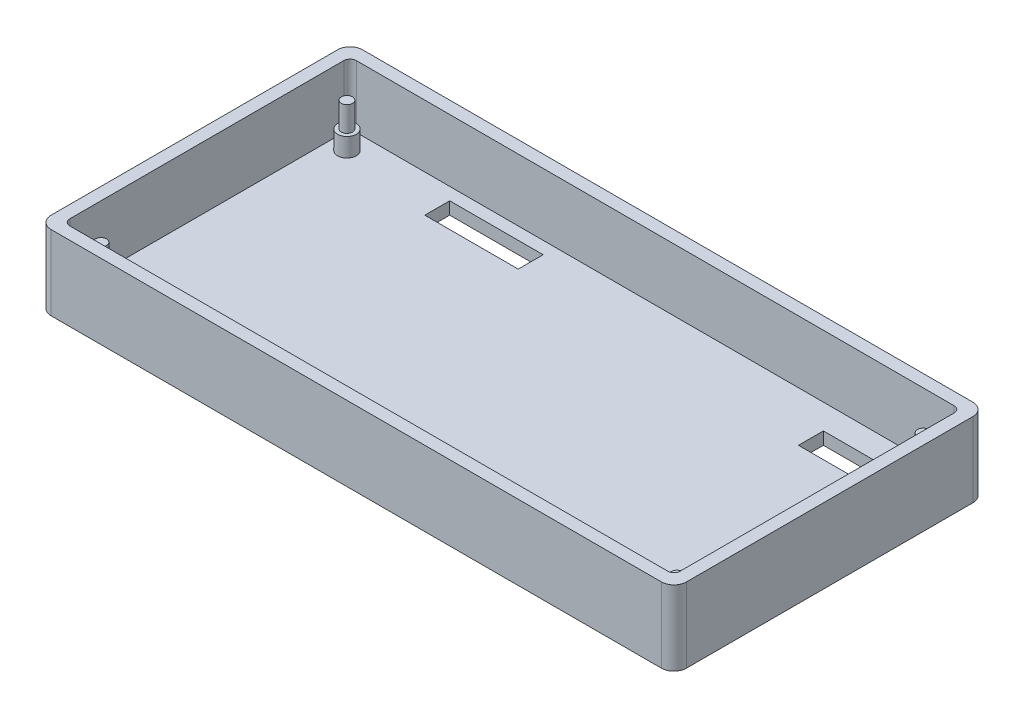
ISO-10303-21;
HEADER;
FILE_DESCRIPTION(('STEP AP214'),'2;1');
FILE_NAME('part.step','',(''),(''),'','','');
FILE_SCHEMA(('AUTOMOTIVE_DESIGN { 1 0 10303 214 1 1 1 1 }'));
ENDSEC;
DATA;
#1=APPLICATION_CONTEXT('core data for automotive mechanical design processes');
#2=APPLICATION_PROTOCOL_DEFINITION('international standard','automotive_design',2000,#1);
#3=PRODUCT_CONTEXT('',#1,'mechanical');
#4=PRODUCT('Part','Part','',(#3));
#5=PRODUCT_RELATED_PRODUCT_CATEGORY('part','',(#4));
#6=PRODUCT_DEFINITION_FORMATION('','',#4);
#7=PRODUCT_DEFINITION_CONTEXT('part definition',#1,'design');
#8=PRODUCT_DEFINITION('design','',#6,#7);
#9=PRODUCT_DEFINITION_SHAPE('','',#8);
#10=(LENGTH_UNIT() NAMED_UNIT(*) SI_UNIT(.MILLI.,.METRE.));
#11=(NAMED_UNIT(*) PLANE_ANGLE_UNIT() SI_UNIT($,.RADIAN.));
#12=(NAMED_UNIT(*) SI_UNIT($,.STERADIAN.) SOLID_ANGLE_UNIT());
#13=UNCERTAINTY_MEASURE_WITH_UNIT(LENGTH_MEASURE(1.E-05),#10,'distance_accuracy_value','');
#14=(GEOMETRIC_REPRESENTATION_CONTEXT(3) GLOBAL_UNCERTAINTY_ASSIGNED_CONTEXT((#13)) GLOBAL_UNIT_ASSIGNED_CONTEXT((#10,
#11,#12)) REPRESENTATION_CONTEXT('',''));
#15=CARTESIAN_POINT('',(0.,0.,0.));
#16=DIRECTION('',(0.,0.,1.));
#17=DIRECTION('',(1.,0.,0.));
#18=AXIS2_PLACEMENT_3D('',#15,#16,#17);
#19=CARTESIAN_POINT('',(51.,2.,25.));
#20=DIRECTION('',(-1.,0.,0.));
#21=DIRECTION('',(0.,0.,1.));
#22=AXIS2_PLACEMENT_3D('',#19,#20,#21);
#23=PLANE('',#22);
#24=DIRECTION('',(0.,0.,-1.));
#25=VECTOR('',#24,1.);
#26=CARTESIAN_POINT('',(51.,0.,25.));
#27=LINE('',#26,#25);
#28=CARTESIAN_POINT('',(51.,0.,23.));
#29=VERTEX_POINT('',#28);
#30=CARTESIAN_POINT('',(51.,0.,-23.));
#31=VERTEX_POINT('',#30);
#32=EDGE_CURVE('E338',#29,#31,#27,.T.);
#33=ORIENTED_EDGE('',*,*,#32,.T.);
#34=DIRECTION('',(0.,-1.,0.));
#35=VECTOR('',#34,1.);
#36=CARTESIAN_POINT('',(51.,2.,-23.));
#37=LINE('',#36,#35);
#38=CARTESIAN_POINT('',(51.,12.,-23.));
#39=VERTEX_POINT('',#38);
#40=EDGE_CURVE('E412',#31,#39,#37,.F.);
#41=ORIENTED_EDGE('',*,*,#40,.T.);
#42=DIRECTION('',(0.,0.,1.));
#43=VECTOR('',#42,1.);
#44=CARTESIAN_POINT('',(51.,12.,0.));
#45=LINE('',#44,#43);
#46=CARTESIAN_POINT('',(51.,12.,23.));
#47=VERTEX_POINT('',#46);
#48=EDGE_CURVE('E305',#39,#47,#45,.T.);
#49=ORIENTED_EDGE('',*,*,#48,.T.);
#50=DIRECTION('',(0.,-1.,0.));
#51=VECTOR('',#50,1.);
#52=CARTESIAN_POINT('',(51.,2.,23.));
#53=LINE('',#52,#51);
#54=EDGE_CURVE('E409',#47,#29,#53,.T.);
#55=ORIENTED_EDGE('',*,*,#54,.T.);
#56=EDGE_LOOP('',(#33,#41,#49,#55));
#57=FACE_BOUND('',#56,.T.);
#58=ADVANCED_FACE('F43',(#57),#23,.F.);
#59=CARTESIAN_POINT('',(-51.,2.,-25.));
#60=DIRECTION('',(0.,0.,1.));
#61=DIRECTION('',(1.,0.,0.));
#62=AXIS2_PLACEMENT_3D('',#59,#60,#61);
#63=PLANE('',#62);
#64=DIRECTION('',(-1.,0.,0.));
#65=VECTOR('',#64,1.);
#66=CARTESIAN_POINT('',(-51.,0.,-25.));
#67=LINE('',#66,#65);
#68=CARTESIAN_POINT('',(49.,0.,-25.));
#69=VERTEX_POINT('',#68);
#70=CARTESIAN_POINT('',(-49.,0.,-25.));
#71=VERTEX_POINT('',#70);
#72=EDGE_CURVE('E341',#69,#71,#67,.T.);
#73=ORIENTED_EDGE('',*,*,#72,.T.);
#74=DIRECTION('',(0.,-1.,0.));
#75=VECTOR('',#74,1.);
#76=CARTESIAN_POINT('',(-49.,2.,-25.));
#77=LINE('',#76,#75);
#78=CARTESIAN_POINT('',(-49.,12.,-25.));
#79=VERTEX_POINT('',#78);
#80=EDGE_CURVE('E407',#71,#79,#77,.F.);
#81=ORIENTED_EDGE('',*,*,#80,.T.);
#82=DIRECTION('',(1.,0.,0.));
#83=VECTOR('',#82,1.);
#84=CARTESIAN_POINT('',(0.,12.,-25.));
#85=LINE('',#84,#83);
#86=CARTESIAN_POINT('',(49.,12.,-25.));
#87=VERTEX_POINT('',#86);
#88=EDGE_CURVE('E302',#79,#87,#85,.T.);
#89=ORIENTED_EDGE('',*,*,#88,.T.);
#90=DIRECTION('',(0.,-1.,0.));
#91=VECTOR('',#90,1.);
#92=CARTESIAN_POINT('',(49.,2.,-25.));
#93=LINE('',#92,#91);
#94=EDGE_CURVE('E404',#87,#69,#93,.T.);
#95=ORIENTED_EDGE('',*,*,#94,.T.);
#96=EDGE_LOOP('',(#73,#81,#89,#95));
#97=FACE_BOUND('',#96,.T.);
#98=ADVANCED_FACE('F490',(#97),#63,.F.);
#99=CARTESIAN_POINT('',(-51.,2.,25.));
#100=DIRECTION('',(1.,0.,0.));
#101=DIRECTION('',(0.,0.,-1.));
#102=AXIS2_PLACEMENT_3D('',#99,#100,#101);
#103=PLANE('',#102);
#104=DIRECTION('',(0.,0.,1.));
#105=VECTOR('',#104,1.);
#106=CARTESIAN_POINT('',(-51.,0.,25.));
#107=LINE('',#106,#105);
#108=CARTESIAN_POINT('',(-51.,0.,-23.));
#109=VERTEX_POINT('',#108);
#110=CARTESIAN_POINT('',(-51.,0.,23.));
#111=VERTEX_POINT('',#110);
#112=EDGE_CURVE('E344',#109,#111,#107,.T.);
#113=ORIENTED_EDGE('',*,*,#112,.T.);
#114=DIRECTION('',(0.,-1.,0.));
#115=VECTOR('',#114,1.);
#116=CARTESIAN_POINT('',(-51.,2.,23.));
#117=LINE('',#116,#115);
#118=CARTESIAN_POINT('',(-51.,12.,23.));
#119=VERTEX_POINT('',#118);
#120=EDGE_CURVE('E394',#111,#119,#117,.F.);
#121=ORIENTED_EDGE('',*,*,#120,.T.);
#122=DIRECTION('',(0.,0.,-1.));
#123=VECTOR('',#122,1.);
#124=CARTESIAN_POINT('',(-51.,12.,0.));
#125=LINE('',#124,#123);
#126=CARTESIAN_POINT('',(-51.,12.,-23.));
#127=VERTEX_POINT('',#126);
#128=EDGE_CURVE('E311',#119,#127,#125,.T.);
#129=ORIENTED_EDGE('',*,*,#128,.T.);
#130=DIRECTION('',(0.,-1.,0.));
#131=VECTOR('',#130,1.);
#132=CARTESIAN_POINT('',(-51.,2.,-23.));
#133=LINE('',#132,#131);
#134=EDGE_CURVE('E391',#127,#109,#133,.T.);
#135=ORIENTED_EDGE('',*,*,#134,.T.);
#136=EDGE_LOOP('',(#113,#121,#129,#135));
#137=FACE_BOUND('',#136,.T.);
#138=ADVANCED_FACE('F495',(#137),#103,.F.);
#139=CARTESIAN_POINT('',(-51.,2.,25.));
#140=DIRECTION('',(0.,0.,-1.));
#141=DIRECTION('',(-1.,0.,0.));
#142=AXIS2_PLACEMENT_3D('',#139,#140,#141);
#143=PLANE('',#142);
#144=DIRECTION('',(-1.,0.,0.));
#145=VECTOR('',#144,1.);
#146=CARTESIAN_POINT('',(0.,12.,25.));
#147=LINE('',#146,#145);
#148=CARTESIAN_POINT('',(49.,12.,25.));
#149=VERTEX_POINT('',#148);
#150=CARTESIAN_POINT('',(-49.,12.,25.));
#151=VERTEX_POINT('',#150);
#152=EDGE_CURVE('E308',#149,#151,#147,.T.);
#153=ORIENTED_EDGE('',*,*,#152,.T.);
#154=DIRECTION('',(0.,-1.,0.));
#155=VECTOR('',#154,1.);
#156=CARTESIAN_POINT('',(-49.,2.,25.));
#157=LINE('',#156,#155);
#158=CARTESIAN_POINT('',(-49.,0.,25.));
#159=VERTEX_POINT('',#158);
#160=EDGE_CURVE('E380',#151,#159,#157,.T.);
#161=ORIENTED_EDGE('',*,*,#160,.T.);
#162=DIRECTION('',(1.,0.,0.));
#163=VECTOR('',#162,1.);
#164=CARTESIAN_POINT('',(-51.,0.,25.));
#165=LINE('',#164,#163);
#166=CARTESIAN_POINT('',(49.,0.,25.));
#167=VERTEX_POINT('',#166);
#168=EDGE_CURVE('E347',#159,#167,#165,.T.);
#169=ORIENTED_EDGE('',*,*,#168,.T.);
#170=DIRECTION('',(0.,-1.,0.));
#171=VECTOR('',#170,1.);
#172=CARTESIAN_POINT('',(49.,2.,25.));
#173=LINE('',#172,#171);
#174=EDGE_CURVE('E378',#167,#149,#173,.F.);
#175=ORIENTED_EDGE('',*,*,#174,.T.);
#176=EDGE_LOOP('',(#153,#161,#169,#175));
#177=FACE_BOUND('',#176,.T.);
#178=ADVANCED_FACE('F501',(#177),#143,.F.);
#179=CARTESIAN_POINT('',(0.,0.,0.));
#180=DIRECTION('',(0.,-1.,0.));
#181=DIRECTION('',(0.,0.,-1.));
#182=AXIS2_PLACEMENT_3D('',#179,#180,#181);
#183=PLANE('',#182);
#184=DIRECTION('',(0.,0.,-1.));
#185=VECTOR('',#184,1.);
#186=CARTESIAN_POINT('',(-31.,0.,0.));
#187=LINE('',#186,#185);
#188=CARTESIAN_POINT('',(-31.,0.,-17.));
#189=VERTEX_POINT('',#188);
#190=CARTESIAN_POINT('',(-31.,0.,-21.));
#191=VERTEX_POINT('',#190);
#192=EDGE_CURVE('E268',#189,#191,#187,.T.);
#193=ORIENTED_EDGE('',*,*,#192,.F.);
#194=DIRECTION('',(-1.,0.,0.));
#195=VECTOR('',#194,1.);
#196=CARTESIAN_POINT('',(0.,0.,-17.));
#197=LINE('',#196,#195);
#198=CARTESIAN_POINT('',(-16.,0.,-17.));
#199=VERTEX_POINT('',#198);
#200=EDGE_CURVE('E263',#199,#189,#197,.T.);
#201=ORIENTED_EDGE('',*,*,#200,.F.);
#202=DIRECTION('',(0.,0.,1.));
#203=VECTOR('',#202,1.);
#204=CARTESIAN_POINT('',(-16.,0.,0.));
#205=LINE('',#204,#203);
#206=CARTESIAN_POINT('',(-16.,0.,-21.));
#207=VERTEX_POINT('',#206);
#208=EDGE_CURVE('E211',#207,#199,#205,.T.);
#209=ORIENTED_EDGE('',*,*,#208,.F.);
#210=DIRECTION('',(1.,0.,0.));
#211=VECTOR('',#210,1.);
#212=CARTESIAN_POINT('',(0.,0.,-21.));
#213=LINE('',#212,#211);
#214=EDGE_CURVE('E266',#191,#207,#213,.T.);
#215=ORIENTED_EDGE('',*,*,#214,.F.);
#216=EDGE_LOOP('',(#193,#201,#209,#215));
#217=FACE_BOUND('',#216,.T.);
#218=DIRECTION('',(0.,0.,-1.));
#219=VECTOR('',#218,1.);
#220=CARTESIAN_POINT('',(31.,0.,0.));
#221=LINE('',#220,#219);
#222=CARTESIAN_POINT('',(31.,0.,-15.));
#223=VERTEX_POINT('',#222);
#224=CARTESIAN_POINT('',(31.,0.,-19.));
#225=VERTEX_POINT('',#224);
#226=EDGE_CURVE('E261',#223,#225,#221,.T.);
#227=ORIENTED_EDGE('',*,*,#226,.F.);
#228=DIRECTION('',(-1.,0.,0.));
#229=VECTOR('',#228,1.);
#230=CARTESIAN_POINT('',(0.,0.,-15.));
#231=LINE('',#230,#229);
#232=CARTESIAN_POINT('',(44.,0.,-15.));
#233=VERTEX_POINT('',#232);
#234=EDGE_CURVE('E235',#233,#223,#231,.T.);
#235=ORIENTED_EDGE('',*,*,#234,.F.);
#236=DIRECTION('',(0.,0.,1.));
#237=VECTOR('',#236,1.);
#238=CARTESIAN_POINT('',(44.,0.,0.));
#239=LINE('',#238,#237);
#240=CARTESIAN_POINT('',(44.,0.,-19.));
#241=VERTEX_POINT('',#240);
#242=EDGE_CURVE('E257',#241,#233,#239,.T.);
#243=ORIENTED_EDGE('',*,*,#242,.F.);
#244=DIRECTION('',(1.,0.,0.));
#245=VECTOR('',#244,1.);
#246=CARTESIAN_POINT('',(0.,0.,-19.));
#247=LINE('',#246,#245);
#248=EDGE_CURVE('E259',#225,#241,#247,.T.);
#249=ORIENTED_EDGE('',*,*,#248,.F.);
#250=EDGE_LOOP('',(#227,#235,#243,#249));
#251=FACE_BOUND('',#250,.T.);
#252=ORIENTED_EDGE('',*,*,#168,.F.);
#253=CARTESIAN_POINT('',(-49.,0.,23.));
#254=DIRECTION('',(0.,-1.,0.));
#255=DIRECTION('',(0.,0.,-1.));
#256=AXIS2_PLACEMENT_3D('',#253,#254,#255);
#257=CIRCLE('',#256,2.);
#258=EDGE_CURVE('E389',#159,#111,#257,.T.);
#259=ORIENTED_EDGE('',*,*,#258,.T.);
#260=ORIENTED_EDGE('',*,*,#112,.F.);
#261=CARTESIAN_POINT('',(-49.,0.,-23.));
#262=DIRECTION('',(0.,-1.,0.));
#263=DIRECTION('',(0.,0.,-1.));
#264=AXIS2_PLACEMENT_3D('',#261,#262,#263);
#265=CIRCLE('',#264,2.);
#266=EDGE_CURVE('E387',#109,#71,#265,.T.);
#267=ORIENTED_EDGE('',*,*,#266,.T.);
#268=ORIENTED_EDGE('',*,*,#72,.F.);
#269=CARTESIAN_POINT('',(49.,0.,-23.));
#270=DIRECTION('',(0.,-1.,0.));
#271=DIRECTION('',(0.,0.,-1.));
#272=AXIS2_PLACEMENT_3D('',#269,#270,#271);
#273=CIRCLE('',#272,2.);
#274=EDGE_CURVE('E385',#69,#31,#273,.T.);
#275=ORIENTED_EDGE('',*,*,#274,.T.);
#276=ORIENTED_EDGE('',*,*,#32,.F.);
#277=CARTESIAN_POINT('',(49.,0.,23.));
#278=DIRECTION('',(0.,-1.,0.));
#279=DIRECTION('',(0.,0.,-1.));
#280=AXIS2_PLACEMENT_3D('',#277,#278,#279);
#281=CIRCLE('',#280,2.);
#282=EDGE_CURVE('E383',#29,#167,#281,.T.);
#283=ORIENTED_EDGE('',*,*,#282,.T.);
#284=EDGE_LOOP('',(#252,#259,#260,#267,#268,#275,#276,#283));
#285=FACE_BOUND('',#284,.T.);
#286=ADVANCED_FACE('F505',(#217,#251,#285),#183,.T.);
#287=CARTESIAN_POINT('',(0.,12.,23.));
#288=DIRECTION('',(0.,0.,-1.));
#289=DIRECTION('',(-1.,0.,0.));
#290=AXIS2_PLACEMENT_3D('',#287,#288,#289);
#291=PLANE('',#290);
#292=DIRECTION('',(1.,0.,0.));
#293=VECTOR('',#292,1.);
#294=CARTESIAN_POINT('',(0.,12.,23.));
#295=LINE('',#294,#293);
#296=CARTESIAN_POINT('',(-48.,12.,23.));
#297=VERTEX_POINT('',#296);
#298=CARTESIAN_POINT('',(48.,12.,23.));
#299=VERTEX_POINT('',#298);
#300=EDGE_CURVE('E314',#297,#299,#295,.T.);
#301=ORIENTED_EDGE('',*,*,#300,.T.);
#302=DIRECTION('',(0.,-1.,0.));
#303=VECTOR('',#302,1.);
#304=CARTESIAN_POINT('',(48.,2.,23.));
#305=LINE('',#304,#303);
#306=CARTESIAN_POINT('',(48.,2.,23.));
#307=VERTEX_POINT('',#306);
#308=EDGE_CURVE('E375',#299,#307,#305,.T.);
#309=ORIENTED_EDGE('',*,*,#308,.T.);
#310=DIRECTION('',(1.,0.,0.));
#311=VECTOR('',#310,1.);
#312=CARTESIAN_POINT('',(0.,2.,23.));
#313=LINE('',#312,#311);
#314=CARTESIAN_POINT('',(-48.,2.,23.));
#315=VERTEX_POINT('',#314);
#316=EDGE_CURVE('E335',#315,#307,#313,.T.);
#317=ORIENTED_EDGE('',*,*,#316,.F.);
#318=DIRECTION('',(0.,-1.,0.));
#319=VECTOR('',#318,1.);
#320=CARTESIAN_POINT('',(-48.,12.,23.));
#321=LINE('',#320,#319);
#322=EDGE_CURVE('E373',#315,#297,#321,.F.);
#323=ORIENTED_EDGE('',*,*,#322,.T.);
#324=EDGE_LOOP('',(#301,#309,#317,#323));
#325=FACE_BOUND('',#324,.T.);
#326=ADVANCED_FACE('F470',(#325),#291,.T.);
#327=CARTESIAN_POINT('',(-49.,12.,0.));
#328=DIRECTION('',(-1.,0.,0.));
#329=DIRECTION('',(0.,0.,1.));
#330=AXIS2_PLACEMENT_3D('',#327,#328,#329);
#331=PLANE('',#330);
#332=DIRECTION('',(0.,0.,-1.));
#333=VECTOR('',#332,1.);
#334=CARTESIAN_POINT('',(-49.,2.,0.));
#335=LINE('',#334,#333);
#336=CARTESIAN_POINT('',(-49.,2.,22.));
#337=VERTEX_POINT('',#336);
#338=CARTESIAN_POINT('',(-49.,2.,-22.));
#339=VERTEX_POINT('',#338);
#340=EDGE_CURVE('E332',#337,#339,#335,.T.);
#341=ORIENTED_EDGE('',*,*,#340,.T.);
#342=DIRECTION('',(0.,-1.,0.));
#343=VECTOR('',#342,1.);
#344=CARTESIAN_POINT('',(-49.,12.,-22.));
#345=LINE('',#344,#343);
#346=CARTESIAN_POINT('',(-49.,12.,-22.));
#347=VERTEX_POINT('',#346);
#348=EDGE_CURVE('E366',#339,#347,#345,.F.);
#349=ORIENTED_EDGE('',*,*,#348,.T.);
#350=DIRECTION('',(0.,0.,-1.));
#351=VECTOR('',#350,1.);
#352=CARTESIAN_POINT('',(-49.,12.,0.));
#353=LINE('',#352,#351);
#354=CARTESIAN_POINT('',(-49.,12.,22.));
#355=VERTEX_POINT('',#354);
#356=EDGE_CURVE('E323',#355,#347,#353,.T.);
#357=ORIENTED_EDGE('',*,*,#356,.F.);
#358=DIRECTION('',(0.,-1.,0.));
#359=VECTOR('',#358,1.);
#360=CARTESIAN_POINT('',(-49.,12.,22.));
#361=LINE('',#360,#359);
#362=EDGE_CURVE('E363',#355,#337,#361,.T.);
#363=ORIENTED_EDGE('',*,*,#362,.T.);
#364=EDGE_LOOP('',(#341,#349,#357,#363));
#365=FACE_BOUND('',#364,.T.);
#366=ADVANCED_FACE('F479',(#365),#331,.F.);
#367=CARTESIAN_POINT('',(0.,12.,-23.));
#368=DIRECTION('',(0.,0.,-1.));
#369=DIRECTION('',(-1.,0.,0.));
#370=AXIS2_PLACEMENT_3D('',#367,#368,#369);
#371=PLANE('',#370);
#372=DIRECTION('',(1.,0.,0.));
#373=VECTOR('',#372,1.);
#374=CARTESIAN_POINT('',(0.,12.,-23.));
#375=LINE('',#374,#373);
#376=CARTESIAN_POINT('',(-48.,12.,-23.));
#377=VERTEX_POINT('',#376);
#378=CARTESIAN_POINT('',(48.,12.,-23.));
#379=VERTEX_POINT('',#378);
#380=EDGE_CURVE('E320',#377,#379,#375,.T.);
#381=ORIENTED_EDGE('',*,*,#380,.F.);
#382=DIRECTION('',(0.,-1.,0.));
#383=VECTOR('',#382,1.);
#384=CARTESIAN_POINT('',(-48.,2.,-23.));
#385=LINE('',#384,#383);
#386=CARTESIAN_POINT('',(-48.,2.,-23.));
#387=VERTEX_POINT('',#386);
#388=EDGE_CURVE('E352',#377,#387,#385,.T.);
#389=ORIENTED_EDGE('',*,*,#388,.T.);
#390=DIRECTION('',(1.,0.,0.));
#391=VECTOR('',#390,1.);
#392=CARTESIAN_POINT('',(0.,2.,-23.));
#393=LINE('',#392,#391);
#394=CARTESIAN_POINT('',(48.,2.,-23.));
#395=VERTEX_POINT('',#394);
#396=EDGE_CURVE('E329',#387,#395,#393,.T.);
#397=ORIENTED_EDGE('',*,*,#396,.T.);
#398=DIRECTION('',(0.,-1.,0.));
#399=VECTOR('',#398,1.);
#400=CARTESIAN_POINT('',(48.,12.,-23.));
#401=LINE('',#400,#399);
#402=EDGE_CURVE('E350',#395,#379,#401,.F.);
#403=ORIENTED_EDGE('',*,*,#402,.T.);
#404=EDGE_LOOP('',(#381,#389,#397,#403));
#405=FACE_BOUND('',#404,.T.);
#406=ADVANCED_FACE('F451',(#405),#371,.F.);
#407=CARTESIAN_POINT('',(49.,12.,0.));
#408=DIRECTION('',(-1.,0.,0.));
#409=DIRECTION('',(0.,0.,1.));
#410=AXIS2_PLACEMENT_3D('',#407,#408,#409);
#411=PLANE('',#410);
#412=DIRECTION('',(0.,0.,-1.));
#413=VECTOR('',#412,1.);
#414=CARTESIAN_POINT('',(49.,12.,0.));
#415=LINE('',#414,#413);
#416=CARTESIAN_POINT('',(49.,12.,22.));
#417=VERTEX_POINT('',#416);
#418=CARTESIAN_POINT('',(49.,12.,-22.));
#419=VERTEX_POINT('',#418);
#420=EDGE_CURVE('E317',#417,#419,#415,.T.);
#421=ORIENTED_EDGE('',*,*,#420,.T.);
#422=DIRECTION('',(0.,-1.,0.));
#423=VECTOR('',#422,1.);
#424=CARTESIAN_POINT('',(49.,12.,-22.));
#425=LINE('',#424,#423);
#426=CARTESIAN_POINT('',(49.,2.,-22.));
#427=VERTEX_POINT('',#426);
#428=EDGE_CURVE('E370',#419,#427,#425,.T.);
#429=ORIENTED_EDGE('',*,*,#428,.T.);
#430=DIRECTION('',(0.,0.,-1.));
#431=VECTOR('',#430,1.);
#432=CARTESIAN_POINT('',(49.,2.,0.));
#433=LINE('',#432,#431);
#434=CARTESIAN_POINT('',(49.,2.,22.));
#435=VERTEX_POINT('',#434);
#436=EDGE_CURVE('E326',#435,#427,#433,.T.);
#437=ORIENTED_EDGE('',*,*,#436,.F.);
#438=DIRECTION('',(0.,-1.,0.));
#439=VECTOR('',#438,1.);
#440=CARTESIAN_POINT('',(49.,12.,22.));
#441=LINE('',#440,#439);
#442=EDGE_CURVE('E368',#435,#417,#441,.F.);
#443=ORIENTED_EDGE('',*,*,#442,.T.);
#444=EDGE_LOOP('',(#421,#429,#437,#443));
#445=FACE_BOUND('',#444,.T.);
#446=ADVANCED_FACE('F462',(#445),#411,.T.);
#447=CARTESIAN_POINT('',(0.,12.,0.));
#448=DIRECTION('',(0.,-1.,0.));
#449=DIRECTION('',(0.,0.,-1.));
#450=AXIS2_PLACEMENT_3D('',#447,#448,#449);
#451=PLANE('',#450);
#452=ORIENTED_EDGE('',*,*,#128,.F.);
#453=CARTESIAN_POINT('',(-49.,12.,23.));
#454=DIRECTION('',(0.,-1.,0.));
#455=DIRECTION('',(0.,0.,-1.));
#456=AXIS2_PLACEMENT_3D('',#453,#454,#455);
#457=CIRCLE('',#456,2.);
#458=EDGE_CURVE('E402',#119,#151,#457,.F.);
#459=ORIENTED_EDGE('',*,*,#458,.T.);
#460=ORIENTED_EDGE('',*,*,#152,.F.);
#461=CARTESIAN_POINT('',(49.,12.,23.));
#462=DIRECTION('',(0.,-1.,0.));
#463=DIRECTION('',(0.,0.,-1.));
#464=AXIS2_PLACEMENT_3D('',#461,#462,#463);
#465=CIRCLE('',#464,2.);
#466=EDGE_CURVE('E396',#149,#47,#465,.F.);
#467=ORIENTED_EDGE('',*,*,#466,.T.);
#468=ORIENTED_EDGE('',*,*,#48,.F.);
#469=CARTESIAN_POINT('',(49.,12.,-23.));
#470=DIRECTION('',(0.,-1.,0.));
#471=DIRECTION('',(0.,0.,-1.));
#472=AXIS2_PLACEMENT_3D('',#469,#470,#471);
#473=CIRCLE('',#472,2.);
#474=EDGE_CURVE('E398',#39,#87,#473,.F.);
#475=ORIENTED_EDGE('',*,*,#474,.T.);
#476=ORIENTED_EDGE('',*,*,#88,.F.);
#477=CARTESIAN_POINT('',(-49.,12.,-23.));
#478=DIRECTION('',(0.,-1.,0.));
#479=DIRECTION('',(0.,0.,-1.));
#480=AXIS2_PLACEMENT_3D('',#477,#478,#479);
#481=CIRCLE('',#480,2.);
#482=EDGE_CURVE('E400',#79,#127,#481,.F.);
#483=ORIENTED_EDGE('',*,*,#482,.T.);
#484=EDGE_LOOP('',(#452,#459,#460,#467,#468,#475,#476,#483));
#485=FACE_BOUND('',#484,.T.);
#486=ORIENTED_EDGE('',*,*,#300,.F.);
#487=CARTESIAN_POINT('',(-48.,12.,22.));
#488=DIRECTION('',(0.,-1.,0.));
#489=DIRECTION('',(0.,0.,-1.));
#490=AXIS2_PLACEMENT_3D('',#487,#488,#489);
#491=CIRCLE('',#490,1.);
#492=EDGE_CURVE('E420',#297,#355,#491,.T.);
#493=ORIENTED_EDGE('',*,*,#492,.T.);
#494=ORIENTED_EDGE('',*,*,#356,.T.);
#495=CARTESIAN_POINT('',(-48.,12.,-22.));
#496=DIRECTION('',(0.,-1.,0.));
#497=DIRECTION('',(0.,0.,-1.));
#498=AXIS2_PLACEMENT_3D('',#495,#496,#497);
#499=CIRCLE('',#498,1.);
#500=EDGE_CURVE('E414',#347,#377,#499,.T.);
#501=ORIENTED_EDGE('',*,*,#500,.T.);
#502=ORIENTED_EDGE('',*,*,#380,.T.);
#503=CARTESIAN_POINT('',(48.,12.,-22.));
#504=DIRECTION('',(0.,-1.,0.));
#505=DIRECTION('',(0.,0.,-1.));
#506=AXIS2_PLACEMENT_3D('',#503,#504,#505);
#507=CIRCLE('',#506,1.);
#508=EDGE_CURVE('E416',#379,#419,#507,.T.);
#509=ORIENTED_EDGE('',*,*,#508,.T.);
#510=ORIENTED_EDGE('',*,*,#420,.F.);
#511=CARTESIAN_POINT('',(48.,12.,22.));
#512=DIRECTION('',(0.,-1.,0.));
#513=DIRECTION('',(0.,0.,-1.));
#514=AXIS2_PLACEMENT_3D('',#511,#512,#513);
#515=CIRCLE('',#514,1.);
#516=EDGE_CURVE('E418',#417,#299,#515,.T.);
#517=ORIENTED_EDGE('',*,*,#516,.T.);
#518=EDGE_LOOP('',(#486,#493,#494,#501,#502,#509,#510,#517));
#519=FACE_BOUND('',#518,.T.);
#520=ADVANCED_FACE('F439',(#485,#519),#451,.F.);
#521=CARTESIAN_POINT('',(0.,2.,0.));
#522=DIRECTION('',(0.,-1.,0.));
#523=DIRECTION('',(0.,0.,-1.));
#524=AXIS2_PLACEMENT_3D('',#521,#522,#523);
#525=PLANE('',#524);
#526=DIRECTION('',(1.,0.,0.));
#527=VECTOR('',#526,1.);
#528=CARTESIAN_POINT('',(-31.,2.,-17.));
#529=LINE('',#528,#527);
#530=CARTESIAN_POINT('',(-31.,2.,-17.));
#531=VERTEX_POINT('',#530);
#532=CARTESIAN_POINT('',(-16.,2.,-17.));
#533=VERTEX_POINT('',#532);
#534=EDGE_CURVE('E218',#531,#533,#529,.T.);
#535=ORIENTED_EDGE('',*,*,#534,.F.);
#536=DIRECTION('',(0.,0.,1.));
#537=VECTOR('',#536,1.);
#538=CARTESIAN_POINT('',(-31.,2.,-21.));
#539=LINE('',#538,#537);
#540=CARTESIAN_POINT('',(-31.,2.,-21.));
#541=VERTEX_POINT('',#540);
#542=EDGE_CURVE('E223',#541,#531,#539,.T.);
#543=ORIENTED_EDGE('',*,*,#542,.F.);
#544=DIRECTION('',(-1.,0.,0.));
#545=VECTOR('',#544,1.);
#546=CARTESIAN_POINT('',(-31.,2.,-21.));
#547=LINE('',#546,#545);
#548=CARTESIAN_POINT('',(-16.,2.,-21.));
#549=VERTEX_POINT('',#548);
#550=EDGE_CURVE('E228',#549,#541,#547,.T.);
#551=ORIENTED_EDGE('',*,*,#550,.F.);
#552=DIRECTION('',(0.,0.,-1.));
#553=VECTOR('',#552,1.);
#554=CARTESIAN_POINT('',(-16.,2.,-21.));
#555=LINE('',#554,#553);
#556=EDGE_CURVE('E208',#533,#549,#555,.T.);
#557=ORIENTED_EDGE('',*,*,#556,.F.);
#558=EDGE_LOOP('',(#535,#543,#551,#557));
#559=FACE_BOUND('',#558,.T.);
#560=DIRECTION('',(1.,0.,0.));
#561=VECTOR('',#560,1.);
#562=CARTESIAN_POINT('',(31.,2.,-15.));
#563=LINE('',#562,#561);
#564=CARTESIAN_POINT('',(31.,2.,-15.));
#565=VERTEX_POINT('',#564);
#566=CARTESIAN_POINT('',(44.,2.,-15.));
#567=VERTEX_POINT('',#566);
#568=EDGE_CURVE('E240',#565,#567,#563,.T.);
#569=ORIENTED_EDGE('',*,*,#568,.F.);
#570=DIRECTION('',(0.,0.,1.));
#571=VECTOR('',#570,1.);
#572=CARTESIAN_POINT('',(31.,2.,-19.));
#573=LINE('',#572,#571);
#574=CARTESIAN_POINT('',(31.,2.,-19.));
#575=VERTEX_POINT('',#574);
#576=EDGE_CURVE('E238',#575,#565,#573,.T.);
#577=ORIENTED_EDGE('',*,*,#576,.F.);
#578=DIRECTION('',(-1.,0.,0.));
#579=VECTOR('',#578,1.);
#580=CARTESIAN_POINT('',(31.,2.,-19.));
#581=LINE('',#580,#579);
#582=CARTESIAN_POINT('',(44.,2.,-19.));
#583=VERTEX_POINT('',#582);
#584=EDGE_CURVE('E245',#583,#575,#581,.T.);
#585=ORIENTED_EDGE('',*,*,#584,.F.);
#586=DIRECTION('',(0.,0.,-1.));
#587=VECTOR('',#586,1.);
#588=CARTESIAN_POINT('',(44.,2.,-19.));
#589=LINE('',#588,#587);
#590=EDGE_CURVE('E242',#567,#583,#589,.T.);
#591=ORIENTED_EDGE('',*,*,#590,.F.);
#592=EDGE_LOOP('',(#569,#577,#585,#591));
#593=FACE_BOUND('',#592,.T.);
#594=CARTESIAN_POINT('',(46.25,2.,-19.75));
#595=DIRECTION('',(0.,-1.,0.));
#596=DIRECTION('',(0.,0.,-1.));
#597=AXIS2_PLACEMENT_3D('',#594,#595,#596);
#598=CIRCLE('',#597,1.5);
#599=CARTESIAN_POINT('',(46.25,2.,-21.25));
#600=VERTEX_POINT('',#599);
#601=EDGE_CURVE('E47',#600,#600,#598,.F.);
#602=ORIENTED_EDGE('',*,*,#601,.F.);
#603=EDGE_LOOP('',(#602));
#604=FACE_BOUND('',#603,.T.);
#605=CARTESIAN_POINT('',(46.25,2.,19.75));
#606=DIRECTION('',(0.,-1.,0.));
#607=DIRECTION('',(0.,0.,-1.));
#608=AXIS2_PLACEMENT_3D('',#605,#606,#607);
#609=CIRCLE('',#608,1.5);
#610=CARTESIAN_POINT('',(46.25,2.,18.25));
#611=VERTEX_POINT('',#610);
#612=EDGE_CURVE('E427',#611,#611,#609,.F.);
#613=ORIENTED_EDGE('',*,*,#612,.F.);
#614=EDGE_LOOP('',(#613));
#615=FACE_BOUND('',#614,.T.);
#616=CARTESIAN_POINT('',(-46.25,2.,19.75));
#617=DIRECTION('',(0.,-1.,0.));
#618=DIRECTION('',(0.,0.,-1.));
#619=AXIS2_PLACEMENT_3D('',#616,#617,#618);
#620=CIRCLE('',#619,1.5);
#621=CARTESIAN_POINT('',(-46.25,2.,18.25));
#622=VERTEX_POINT('',#621);
#623=EDGE_CURVE('E425',#622,#622,#620,.F.);
#624=ORIENTED_EDGE('',*,*,#623,.F.);
#625=EDGE_LOOP('',(#624));
#626=FACE_BOUND('',#625,.T.);
#627=CARTESIAN_POINT('',(-46.25,2.,-19.75));
#628=DIRECTION('',(0.,-1.,0.));
#629=DIRECTION('',(0.,0.,-1.));
#630=AXIS2_PLACEMENT_3D('',#627,#628,#629);
#631=CIRCLE('',#630,1.5);
#632=CARTESIAN_POINT('',(-46.25,2.,-21.25));
#633=VERTEX_POINT('',#632);
#634=EDGE_CURVE('E422',#633,#633,#631,.F.);
#635=ORIENTED_EDGE('',*,*,#634,.F.);
#636=EDGE_LOOP('',(#635));
#637=FACE_BOUND('',#636,.T.);
#638=ORIENTED_EDGE('',*,*,#396,.F.);
#639=CARTESIAN_POINT('',(-48.,2.,-22.));
#640=DIRECTION('',(0.,-1.,0.));
#641=DIRECTION('',(0.,0.,-1.));
#642=AXIS2_PLACEMENT_3D('',#639,#640,#641);
#643=CIRCLE('',#642,1.);
#644=EDGE_CURVE('E361',#387,#339,#643,.F.);
#645=ORIENTED_EDGE('',*,*,#644,.T.);
#646=ORIENTED_EDGE('',*,*,#340,.F.);
#647=CARTESIAN_POINT('',(-48.,2.,22.));
#648=DIRECTION('',(0.,-1.,0.));
#649=DIRECTION('',(0.,0.,-1.));
#650=AXIS2_PLACEMENT_3D('',#647,#648,#649);
#651=CIRCLE('',#650,1.);
#652=EDGE_CURVE('E355',#337,#315,#651,.F.);
#653=ORIENTED_EDGE('',*,*,#652,.T.);
#654=ORIENTED_EDGE('',*,*,#316,.T.);
#655=CARTESIAN_POINT('',(48.,2.,22.));
#656=DIRECTION('',(0.,-1.,0.));
#657=DIRECTION('',(0.,0.,-1.));
#658=AXIS2_PLACEMENT_3D('',#655,#656,#657);
#659=CIRCLE('',#658,1.);
#660=EDGE_CURVE('E357',#307,#435,#659,.F.);
#661=ORIENTED_EDGE('',*,*,#660,.T.);
#662=ORIENTED_EDGE('',*,*,#436,.T.);
#663=CARTESIAN_POINT('',(48.,2.,-22.));
#664=DIRECTION('',(0.,-1.,0.));
#665=DIRECTION('',(0.,0.,-1.));
#666=AXIS2_PLACEMENT_3D('',#663,#664,#665);
#667=CIRCLE('',#666,1.);
#668=EDGE_CURVE('E359',#427,#395,#667,.F.);
#669=ORIENTED_EDGE('',*,*,#668,.T.);
#670=EDGE_LOOP('',(#638,#645,#646,#653,#654,#661,#662,#669));
#671=FACE_BOUND('',#670,.T.);
#672=ADVANCED_FACE('F225',(#559,#593,#604,#615,#626,#637,#671),#525,.F.);
#673=CARTESIAN_POINT('',(-48.,12.,-22.));
#674=DIRECTION('',(0.,1.,0.));
#675=DIRECTION('',(0.,0.,1.));
#676=AXIS2_PLACEMENT_3D('',#673,#674,#675);
#677=CYLINDRICAL_SURFACE('',#676,1.);
#678=ORIENTED_EDGE('',*,*,#500,.F.);
#679=ORIENTED_EDGE('',*,*,#348,.F.);
#680=ORIENTED_EDGE('',*,*,#644,.F.);
#681=ORIENTED_EDGE('',*,*,#388,.F.);
#682=EDGE_LOOP('',(#678,#679,#680,#681));
#683=FACE_BOUND('',#682,.T.);
#684=ADVANCED_FACE('F438',(#683),#677,.F.);
#685=CARTESIAN_POINT('',(48.,12.,-22.));
#686=DIRECTION('',(0.,-1.,0.));
#687=DIRECTION('',(0.,0.,-1.));
#688=AXIS2_PLACEMENT_3D('',#685,#686,#687);
#689=CYLINDRICAL_SURFACE('',#688,1.);
#690=ORIENTED_EDGE('',*,*,#508,.F.);
#691=ORIENTED_EDGE('',*,*,#402,.F.);
#692=ORIENTED_EDGE('',*,*,#668,.F.);
#693=ORIENTED_EDGE('',*,*,#428,.F.);
#694=EDGE_LOOP('',(#690,#691,#692,#693));
#695=FACE_BOUND('',#694,.T.);
#696=ADVANCED_FACE('F455',(#695),#689,.F.);
#697=CARTESIAN_POINT('',(48.,12.,22.));
#698=DIRECTION('',(0.,1.,0.));
#699=DIRECTION('',(0.,0.,1.));
#700=AXIS2_PLACEMENT_3D('',#697,#698,#699);
#701=CYLINDRICAL_SURFACE('',#700,1.);
#702=ORIENTED_EDGE('',*,*,#516,.F.);
#703=ORIENTED_EDGE('',*,*,#442,.F.);
#704=ORIENTED_EDGE('',*,*,#660,.F.);
#705=ORIENTED_EDGE('',*,*,#308,.F.);
#706=EDGE_LOOP('',(#702,#703,#704,#705));
#707=FACE_BOUND('',#706,.T.);
#708=ADVANCED_FACE('F466',(#707),#701,.F.);
#709=CARTESIAN_POINT('',(-48.,12.,22.));
#710=DIRECTION('',(0.,-1.,0.));
#711=DIRECTION('',(0.,0.,-1.));
#712=AXIS2_PLACEMENT_3D('',#709,#710,#711);
#713=CYLINDRICAL_SURFACE('',#712,1.);
#714=ORIENTED_EDGE('',*,*,#492,.F.);
#715=ORIENTED_EDGE('',*,*,#322,.F.);
#716=ORIENTED_EDGE('',*,*,#652,.F.);
#717=ORIENTED_EDGE('',*,*,#362,.F.);
#718=EDGE_LOOP('',(#714,#715,#716,#717));
#719=FACE_BOUND('',#718,.T.);
#720=ADVANCED_FACE('F474',(#719),#713,.F.);
#721=CARTESIAN_POINT('',(-49.,2.,23.));
#722=DIRECTION('',(0.,-1.,0.));
#723=DIRECTION('',(0.,0.,-1.));
#724=AXIS2_PLACEMENT_3D('',#721,#722,#723);
#725=CYLINDRICAL_SURFACE('',#724,2.);
#726=ORIENTED_EDGE('',*,*,#458,.F.);
#727=ORIENTED_EDGE('',*,*,#120,.F.);
#728=ORIENTED_EDGE('',*,*,#258,.F.);
#729=ORIENTED_EDGE('',*,*,#160,.F.);
#730=EDGE_LOOP('',(#726,#727,#728,#729));
#731=FACE_BOUND('',#730,.T.);
#732=ADVANCED_FACE('F646',(#731),#725,.T.);
#733=CARTESIAN_POINT('',(-49.,2.,-23.));
#734=DIRECTION('',(0.,-1.,0.));
#735=DIRECTION('',(0.,0.,-1.));
#736=AXIS2_PLACEMENT_3D('',#733,#734,#735);
#737=CYLINDRICAL_SURFACE('',#736,2.);
#738=ORIENTED_EDGE('',*,*,#482,.F.);
#739=ORIENTED_EDGE('',*,*,#80,.F.);
#740=ORIENTED_EDGE('',*,*,#266,.F.);
#741=ORIENTED_EDGE('',*,*,#134,.F.);
#742=EDGE_LOOP('',(#738,#739,#740,#741));
#743=FACE_BOUND('',#742,.T.);
#744=ADVANCED_FACE('F641',(#743),#737,.T.);
#745=CARTESIAN_POINT('',(49.,2.,-23.));
#746=DIRECTION('',(0.,-1.,0.));
#747=DIRECTION('',(0.,0.,-1.));
#748=AXIS2_PLACEMENT_3D('',#745,#746,#747);
#749=CYLINDRICAL_SURFACE('',#748,2.);
#750=ORIENTED_EDGE('',*,*,#474,.F.);
#751=ORIENTED_EDGE('',*,*,#40,.F.);
#752=ORIENTED_EDGE('',*,*,#274,.F.);
#753=ORIENTED_EDGE('',*,*,#94,.F.);
#754=EDGE_LOOP('',(#750,#751,#752,#753));
#755=FACE_BOUND('',#754,.T.);
#756=ADVANCED_FACE('F634',(#755),#749,.T.);
#757=CARTESIAN_POINT('',(49.,2.,23.));
#758=DIRECTION('',(0.,-1.,0.));
#759=DIRECTION('',(0.,0.,-1.));
#760=AXIS2_PLACEMENT_3D('',#757,#758,#759);
#761=CYLINDRICAL_SURFACE('',#760,2.);
#762=ORIENTED_EDGE('',*,*,#466,.F.);
#763=ORIENTED_EDGE('',*,*,#174,.F.);
#764=ORIENTED_EDGE('',*,*,#282,.F.);
#765=ORIENTED_EDGE('',*,*,#54,.F.);
#766=EDGE_LOOP('',(#762,#763,#764,#765));
#767=FACE_BOUND('',#766,.T.);
#768=ADVANCED_FACE('F45',(#767),#761,.T.);
#769=CARTESIAN_POINT('',(-46.25,5.,-19.75));
#770=DIRECTION('',(0.,-1.,0.));
#771=DIRECTION('',(0.,0.,-1.));
#772=AXIS2_PLACEMENT_3D('',#769,#770,#771);
#773=CYLINDRICAL_SURFACE('',#772,1.5);
#774=CARTESIAN_POINT('',(-46.25,5.,-19.75));
#775=DIRECTION('',(0.,1.,0.));
#776=DIRECTION('',(0.,0.,1.));
#777=AXIS2_PLACEMENT_3D('',#774,#775,#776);
#778=CIRCLE('',#777,1.5);
#779=CARTESIAN_POINT('',(-46.25,5.,-18.25));
#780=VERTEX_POINT('',#779);
#781=EDGE_CURVE('E299',#780,#780,#778,.T.);
#782=ORIENTED_EDGE('',*,*,#781,.F.);
#783=EDGE_LOOP('',(#782));
#784=FACE_BOUND('',#783,.T.);
#785=ORIENTED_EDGE('',*,*,#634,.T.);
#786=EDGE_LOOP('',(#785));
#787=FACE_BOUND('',#786,.T.);
#788=ADVANCED_FACE('F521',(#784,#787),#773,.T.);
#789=CARTESIAN_POINT('',(0.,5.,0.));
#790=DIRECTION('',(0.,1.,0.));
#791=DIRECTION('',(0.,0.,1.));
#792=AXIS2_PLACEMENT_3D('',#789,#790,#791);
#793=PLANE('',#792);
#794=CARTESIAN_POINT('',(-46.25,5.,-19.75));
#795=DIRECTION('',(0.,1.,0.));
#796=DIRECTION('',(0.,0.,1.));
#797=AXIS2_PLACEMENT_3D('',#794,#795,#796);
#798=CIRCLE('',#797,0.899999999999996);
#799=CARTESIAN_POINT('',(-46.25,5.,-18.85));
#800=VERTEX_POINT('',#799);
#801=EDGE_CURVE('E285',#800,#800,#798,.T.);
#802=ORIENTED_EDGE('',*,*,#801,.F.);
#803=EDGE_LOOP('',(#802));
#804=FACE_BOUND('',#803,.T.);
#805=ORIENTED_EDGE('',*,*,#781,.T.);
#806=EDGE_LOOP('',(#805));
#807=FACE_BOUND('',#806,.T.);
#808=ADVANCED_FACE('F524',(#804,#807),#793,.T.);
#809=CARTESIAN_POINT('',(-46.25,5.,19.75));
#810=DIRECTION('',(0.,-1.,0.));
#811=DIRECTION('',(0.,0.,-1.));
#812=AXIS2_PLACEMENT_3D('',#809,#810,#811);
#813=CYLINDRICAL_SURFACE('',#812,1.5);
#814=CARTESIAN_POINT('',(-46.25,5.,19.75));
#815=DIRECTION('',(0.,1.,0.));
#816=DIRECTION('',(0.,0.,1.));
#817=AXIS2_PLACEMENT_3D('',#814,#815,#816);
#818=CIRCLE('',#817,1.5);
#819=CARTESIAN_POINT('',(-46.25,5.,21.25));
#820=VERTEX_POINT('',#819);
#821=EDGE_CURVE('E296',#820,#820,#818,.T.);
#822=ORIENTED_EDGE('',*,*,#821,.F.);
#823=EDGE_LOOP('',(#822));
#824=FACE_BOUND('',#823,.T.);
#825=ORIENTED_EDGE('',*,*,#623,.T.);
#826=EDGE_LOOP('',(#825));
#827=FACE_BOUND('',#826,.T.);
#828=ADVANCED_FACE('F528',(#824,#827),#813,.T.);
#829=CARTESIAN_POINT('',(0.,5.,0.));
#830=DIRECTION('',(0.,1.,0.));
#831=DIRECTION('',(0.,0.,1.));
#832=AXIS2_PLACEMENT_3D('',#829,#830,#831);
#833=PLANE('',#832);
#834=CARTESIAN_POINT('',(-46.25,5.,19.75));
#835=DIRECTION('',(0.,1.,0.));
#836=DIRECTION('',(0.,0.,1.));
#837=AXIS2_PLACEMENT_3D('',#834,#835,#836);
#838=CIRCLE('',#837,0.899999999999996);
#839=CARTESIAN_POINT('',(-46.25,5.,20.65));
#840=VERTEX_POINT('',#839);
#841=EDGE_CURVE('E279',#840,#840,#838,.T.);
#842=ORIENTED_EDGE('',*,*,#841,.F.);
#843=EDGE_LOOP('',(#842));
#844=FACE_BOUND('',#843,.T.);
#845=ORIENTED_EDGE('',*,*,#821,.T.);
#846=EDGE_LOOP('',(#845));
#847=FACE_BOUND('',#846,.T.);
#848=ADVANCED_FACE('F530',(#844,#847),#833,.T.);
#849=CARTESIAN_POINT('',(46.25,5.,19.75));
#850=DIRECTION('',(0.,-1.,0.));
#851=DIRECTION('',(0.,0.,-1.));
#852=AXIS2_PLACEMENT_3D('',#849,#850,#851);
#853=CYLINDRICAL_SURFACE('',#852,1.5);
#854=CARTESIAN_POINT('',(46.25,5.,19.75));
#855=DIRECTION('',(0.,1.,0.));
#856=DIRECTION('',(0.,0.,1.));
#857=AXIS2_PLACEMENT_3D('',#854,#855,#856);
#858=CIRCLE('',#857,1.5);
#859=CARTESIAN_POINT('',(46.25,5.,21.25));
#860=VERTEX_POINT('',#859);
#861=EDGE_CURVE('E293',#860,#860,#858,.T.);
#862=ORIENTED_EDGE('',*,*,#861,.F.);
#863=EDGE_LOOP('',(#862));
#864=FACE_BOUND('',#863,.T.);
#865=ORIENTED_EDGE('',*,*,#612,.T.);
#866=EDGE_LOOP('',(#865));
#867=FACE_BOUND('',#866,.T.);
#868=ADVANCED_FACE('F533',(#864,#867),#853,.T.);
#869=CARTESIAN_POINT('',(0.,5.,0.));
#870=DIRECTION('',(0.,1.,0.));
#871=DIRECTION('',(0.,0.,1.));
#872=AXIS2_PLACEMENT_3D('',#869,#870,#871);
#873=PLANE('',#872);
#874=CARTESIAN_POINT('',(46.25,5.,19.75));
#875=DIRECTION('',(0.,1.,0.));
#876=DIRECTION('',(0.,0.,1.));
#877=AXIS2_PLACEMENT_3D('',#874,#875,#876);
#878=CIRCLE('',#877,0.899999999999996);
#879=CARTESIAN_POINT('',(46.25,5.,20.65));
#880=VERTEX_POINT('',#879);
#881=EDGE_CURVE('E13',#880,#880,#878,.T.);
#882=ORIENTED_EDGE('',*,*,#881,.F.);
#883=EDGE_LOOP('',(#882));
#884=FACE_BOUND('',#883,.T.);
#885=ORIENTED_EDGE('',*,*,#861,.T.);
#886=EDGE_LOOP('',(#885));
#887=FACE_BOUND('',#886,.T.);
#888=ADVANCED_FACE('F538',(#884,#887),#873,.T.);
#889=CARTESIAN_POINT('',(46.25,5.,-19.75));
#890=DIRECTION('',(0.,-1.,0.));
#891=DIRECTION('',(0.,0.,-1.));
#892=AXIS2_PLACEMENT_3D('',#889,#890,#891);
#893=CYLINDRICAL_SURFACE('',#892,1.5);
#894=CARTESIAN_POINT('',(46.25,5.,-19.75));
#895=DIRECTION('',(0.,1.,0.));
#896=DIRECTION('',(0.,0.,1.));
#897=AXIS2_PLACEMENT_3D('',#894,#895,#896);
#898=CIRCLE('',#897,1.5);
#899=CARTESIAN_POINT('',(46.25,5.,-18.25));
#900=VERTEX_POINT('',#899);
#901=EDGE_CURVE('E288',#900,#900,#898,.T.);
#902=ORIENTED_EDGE('',*,*,#901,.F.);
#903=EDGE_LOOP('',(#902));
#904=FACE_BOUND('',#903,.T.);
#905=ORIENTED_EDGE('',*,*,#601,.T.);
#906=EDGE_LOOP('',(#905));
#907=FACE_BOUND('',#906,.T.);
#908=ADVANCED_FACE('F434',(#904,#907),#893,.T.);
#909=CARTESIAN_POINT('',(0.,5.,0.));
#910=DIRECTION('',(0.,1.,0.));
#911=DIRECTION('',(0.,0.,1.));
#912=AXIS2_PLACEMENT_3D('',#909,#910,#911);
#913=PLANE('',#912);
#914=CARTESIAN_POINT('',(46.25,5.,-19.75));
#915=DIRECTION('',(0.,1.,0.));
#916=DIRECTION('',(0.,0.,1.));
#917=AXIS2_PLACEMENT_3D('',#914,#915,#916);
#918=CIRCLE('',#917,0.899999999999996);
#919=CARTESIAN_POINT('',(46.25,5.,-18.85));
#920=VERTEX_POINT('',#919);
#921=EDGE_CURVE('E52',#920,#920,#918,.T.);
#922=ORIENTED_EDGE('',*,*,#921,.F.);
#923=EDGE_LOOP('',(#922));
#924=FACE_BOUND('',#923,.T.);
#925=ORIENTED_EDGE('',*,*,#901,.T.);
#926=EDGE_LOOP('',(#925));
#927=FACE_BOUND('',#926,.T.);
#928=ADVANCED_FACE('F545',(#924,#927),#913,.T.);
#929=CARTESIAN_POINT('',(-46.25,9.,-19.75));
#930=DIRECTION('',(0.,-1.,0.));
#931=DIRECTION('',(0.,0.,-1.));
#932=AXIS2_PLACEMENT_3D('',#929,#930,#931);
#933=CYLINDRICAL_SURFACE('',#932,0.899999999999996);
#934=CARTESIAN_POINT('',(-46.25,9.,-19.75));
#935=DIRECTION('',(0.,1.,0.));
#936=DIRECTION('',(0.,0.,1.));
#937=AXIS2_PLACEMENT_3D('',#934,#935,#936);
#938=CIRCLE('',#937,0.899999999999996);
#939=CARTESIAN_POINT('',(-46.25,9.,-18.85));
#940=VERTEX_POINT('',#939);
#941=EDGE_CURVE('E282',#940,#940,#938,.T.);
#942=ORIENTED_EDGE('',*,*,#941,.F.);
#943=EDGE_LOOP('',(#942));
#944=FACE_BOUND('',#943,.T.);
#945=ORIENTED_EDGE('',*,*,#801,.T.);
#946=EDGE_LOOP('',(#945));
#947=FACE_BOUND('',#946,.T.);
#948=ADVANCED_FACE('F548',(#944,#947),#933,.T.);
#949=CARTESIAN_POINT('',(-46.25,9.,-19.75));
#950=DIRECTION('',(0.,1.,0.));
#951=DIRECTION('',(0.,0.,1.));
#952=AXIS2_PLACEMENT_3D('',#949,#950,#951);
#953=PLANE('',#952);
#954=ORIENTED_EDGE('',*,*,#941,.T.);
#955=EDGE_LOOP('',(#954));
#956=FACE_BOUND('',#955,.T.);
#957=ADVANCED_FACE('F555',(#956),#953,.T.);
#958=CARTESIAN_POINT('',(-46.25,9.,19.75));
#959=DIRECTION('',(0.,-1.,0.));
#960=DIRECTION('',(0.,0.,-1.));
#961=AXIS2_PLACEMENT_3D('',#958,#959,#960);
#962=CYLINDRICAL_SURFACE('',#961,0.899999999999996);
#963=CARTESIAN_POINT('',(-46.25,9.,19.75));
#964=DIRECTION('',(0.,1.,0.));
#965=DIRECTION('',(0.,0.,1.));
#966=AXIS2_PLACEMENT_3D('',#963,#964,#965);
#967=CIRCLE('',#966,0.899999999999996);
#968=CARTESIAN_POINT('',(-46.25,9.,20.65));
#969=VERTEX_POINT('',#968);
#970=EDGE_CURVE('E276',#969,#969,#967,.T.);
#971=ORIENTED_EDGE('',*,*,#970,.F.);
#972=EDGE_LOOP('',(#971));
#973=FACE_BOUND('',#972,.T.);
#974=ORIENTED_EDGE('',*,*,#841,.T.);
#975=EDGE_LOOP('',(#974));
#976=FACE_BOUND('',#975,.T.);
#977=ADVANCED_FACE('F559',(#973,#976),#962,.T.);
#978=CARTESIAN_POINT('',(-46.25,9.,19.75));
#979=DIRECTION('',(0.,1.,0.));
#980=DIRECTION('',(0.,0.,1.));
#981=AXIS2_PLACEMENT_3D('',#978,#979,#980);
#982=PLANE('',#981);
#983=ORIENTED_EDGE('',*,*,#970,.T.);
#984=EDGE_LOOP('',(#983));
#985=FACE_BOUND('',#984,.T.);
#986=ADVANCED_FACE('F563',(#985),#982,.T.);
#987=CARTESIAN_POINT('',(46.25,9.,-19.75));
#988=DIRECTION('',(0.,-1.,0.));
#989=DIRECTION('',(0.,0.,-1.));
#990=AXIS2_PLACEMENT_3D('',#987,#988,#989);
#991=CYLINDRICAL_SURFACE('',#990,0.899999999999996);
#992=CARTESIAN_POINT('',(46.25,9.,-19.75));
#993=DIRECTION('',(0.,1.,0.));
#994=DIRECTION('',(0.,0.,1.));
#995=AXIS2_PLACEMENT_3D('',#992,#993,#994);
#996=CIRCLE('',#995,0.899999999999996);
#997=CARTESIAN_POINT('',(46.25,9.,-18.85));
#998=VERTEX_POINT('',#997);
#999=EDGE_CURVE('E272',#998,#998,#996,.T.);
#1000=ORIENTED_EDGE('',*,*,#999,.F.);
#1001=EDGE_LOOP('',(#1000));
#1002=FACE_BOUND('',#1001,.T.);
#1003=ORIENTED_EDGE('',*,*,#921,.T.);
#1004=EDGE_LOOP('',(#1003));
#1005=FACE_BOUND('',#1004,.T.);
#1006=ADVANCED_FACE('F567',(#1002,#1005),#991,.T.);
#1007=CARTESIAN_POINT('',(46.25,9.,-19.75));
#1008=DIRECTION('',(0.,1.,0.));
#1009=DIRECTION('',(0.,0.,1.));
#1010=AXIS2_PLACEMENT_3D('',#1007,#1008,#1009);
#1011=PLANE('',#1010);
#1012=ORIENTED_EDGE('',*,*,#999,.T.);
#1013=EDGE_LOOP('',(#1012));
#1014=FACE_BOUND('',#1013,.T.);
#1015=ADVANCED_FACE('F571',(#1014),#1011,.T.);
#1016=CARTESIAN_POINT('',(46.25,9.,19.75));
#1017=DIRECTION('',(0.,-1.,0.));
#1018=DIRECTION('',(0.,0.,-1.));
#1019=AXIS2_PLACEMENT_3D('',#1016,#1017,#1018);
#1020=CYLINDRICAL_SURFACE('',#1019,0.899999999999996);
#1021=CARTESIAN_POINT('',(46.25,9.,19.75));
#1022=DIRECTION('',(0.,1.,0.));
#1023=DIRECTION('',(0.,0.,1.));
#1024=AXIS2_PLACEMENT_3D('',#1021,#1022,#1023);
#1025=CIRCLE('',#1024,0.899999999999996);
#1026=CARTESIAN_POINT('',(46.25,9.,20.65));
#1027=VERTEX_POINT('',#1026);
#1028=EDGE_CURVE('E270',#1027,#1027,#1025,.T.);
#1029=ORIENTED_EDGE('',*,*,#1028,.F.);
#1030=EDGE_LOOP('',(#1029));
#1031=FACE_BOUND('',#1030,.T.);
#1032=ORIENTED_EDGE('',*,*,#881,.T.);
#1033=EDGE_LOOP('',(#1032));
#1034=FACE_BOUND('',#1033,.T.);
#1035=ADVANCED_FACE('F575',(#1031,#1034),#1020,.T.);
#1036=CARTESIAN_POINT('',(46.25,9.,19.75));
#1037=DIRECTION('',(0.,1.,0.));
#1038=DIRECTION('',(0.,0.,1.));
#1039=AXIS2_PLACEMENT_3D('',#1036,#1037,#1038);
#1040=PLANE('',#1039);
#1041=ORIENTED_EDGE('',*,*,#1028,.T.);
#1042=EDGE_LOOP('',(#1041));
#1043=FACE_BOUND('',#1042,.T.);
#1044=ADVANCED_FACE('F579',(#1043),#1040,.T.);
#1045=CARTESIAN_POINT('',(31.,-8.,-19.));
#1046=DIRECTION('',(-1.,0.,0.));
#1047=DIRECTION('',(0.,0.,1.));
#1048=AXIS2_PLACEMENT_3D('',#1045,#1046,#1047);
#1049=PLANE('',#1048);
#1050=ORIENTED_EDGE('',*,*,#226,.T.);
#1051=DIRECTION('',(0.,1.,0.));
#1052=VECTOR('',#1051,1.);
#1053=CARTESIAN_POINT('',(31.,-8.,-19.));
#1054=LINE('',#1053,#1052);
#1055=EDGE_CURVE('E249',#225,#575,#1054,.T.);
#1056=ORIENTED_EDGE('',*,*,#1055,.T.);
#1057=ORIENTED_EDGE('',*,*,#576,.T.);
#1058=DIRECTION('',(0.,1.,0.));
#1059=VECTOR('',#1058,1.);
#1060=CARTESIAN_POINT('',(31.,-8.,-15.));
#1061=LINE('',#1060,#1059);
#1062=EDGE_CURVE('E248',#223,#565,#1061,.T.);
#1063=ORIENTED_EDGE('',*,*,#1062,.F.);
#1064=EDGE_LOOP('',(#1050,#1056,#1057,#1063));
#1065=FACE_BOUND('',#1064,.T.);
#1066=ADVANCED_FACE('F583',(#1065),#1049,.F.);
#1067=CARTESIAN_POINT('',(31.,-8.,-19.));
#1068=DIRECTION('',(0.,0.,-1.));
#1069=DIRECTION('',(-1.,0.,0.));
#1070=AXIS2_PLACEMENT_3D('',#1067,#1068,#1069);
#1071=PLANE('',#1070);
#1072=ORIENTED_EDGE('',*,*,#248,.T.);
#1073=DIRECTION('',(0.,1.,0.));
#1074=VECTOR('',#1073,1.);
#1075=CARTESIAN_POINT('',(44.,-8.,-19.));
#1076=LINE('',#1075,#1074);
#1077=EDGE_CURVE('E251',#241,#583,#1076,.T.);
#1078=ORIENTED_EDGE('',*,*,#1077,.T.);
#1079=ORIENTED_EDGE('',*,*,#584,.T.);
#1080=ORIENTED_EDGE('',*,*,#1055,.F.);
#1081=EDGE_LOOP('',(#1072,#1078,#1079,#1080));
#1082=FACE_BOUND('',#1081,.T.);
#1083=ADVANCED_FACE('F587',(#1082),#1071,.F.);
#1084=CARTESIAN_POINT('',(44.,-8.,-19.));
#1085=DIRECTION('',(1.,0.,0.));
#1086=DIRECTION('',(0.,0.,-1.));
#1087=AXIS2_PLACEMENT_3D('',#1084,#1085,#1086);
#1088=PLANE('',#1087);
#1089=ORIENTED_EDGE('',*,*,#242,.T.);
#1090=DIRECTION('',(0.,1.,0.));
#1091=VECTOR('',#1090,1.);
#1092=CARTESIAN_POINT('',(44.,-8.,-15.));
#1093=LINE('',#1092,#1091);
#1094=EDGE_CURVE('E68',#233,#567,#1093,.T.);
#1095=ORIENTED_EDGE('',*,*,#1094,.T.);
#1096=ORIENTED_EDGE('',*,*,#590,.T.);
#1097=ORIENTED_EDGE('',*,*,#1077,.F.);
#1098=EDGE_LOOP('',(#1089,#1095,#1096,#1097));
#1099=FACE_BOUND('',#1098,.T.);
#1100=ADVANCED_FACE('F593',(#1099),#1088,.F.);
#1101=CARTESIAN_POINT('',(31.,-8.,-15.));
#1102=DIRECTION('',(0.,0.,1.));
#1103=DIRECTION('',(1.,0.,0.));
#1104=AXIS2_PLACEMENT_3D('',#1101,#1102,#1103);
#1105=PLANE('',#1104);
#1106=ORIENTED_EDGE('',*,*,#234,.T.);
#1107=ORIENTED_EDGE('',*,*,#1062,.T.);
#1108=ORIENTED_EDGE('',*,*,#568,.T.);
#1109=ORIENTED_EDGE('',*,*,#1094,.F.);
#1110=EDGE_LOOP('',(#1106,#1107,#1108,#1109));
#1111=FACE_BOUND('',#1110,.T.);
#1112=ADVANCED_FACE('F589',(#1111),#1105,.F.);
#1113=CARTESIAN_POINT('',(-31.,-8.,-21.));
#1114=DIRECTION('',(-1.,0.,0.));
#1115=DIRECTION('',(0.,0.,1.));
#1116=AXIS2_PLACEMENT_3D('',#1113,#1114,#1115);
#1117=PLANE('',#1116);
#1118=ORIENTED_EDGE('',*,*,#192,.T.);
#1119=DIRECTION('',(0.,1.,0.));
#1120=VECTOR('',#1119,1.);
#1121=CARTESIAN_POINT('',(-31.,-8.,-21.));
#1122=LINE('',#1121,#1120);
#1123=EDGE_CURVE('E233',#191,#541,#1122,.T.);
#1124=ORIENTED_EDGE('',*,*,#1123,.T.);
#1125=ORIENTED_EDGE('',*,*,#542,.T.);
#1126=DIRECTION('',(0.,1.,0.));
#1127=VECTOR('',#1126,1.);
#1128=CARTESIAN_POINT('',(-31.,-8.,-17.));
#1129=LINE('',#1128,#1127);
#1130=EDGE_CURVE('E214',#189,#531,#1129,.T.);
#1131=ORIENTED_EDGE('',*,*,#1130,.F.);
#1132=EDGE_LOOP('',(#1118,#1124,#1125,#1131));
#1133=FACE_BOUND('',#1132,.T.);
#1134=ADVANCED_FACE('F592',(#1133),#1117,.F.);
#1135=CARTESIAN_POINT('',(-31.,-8.,-21.));
#1136=DIRECTION('',(0.,0.,-1.));
#1137=DIRECTION('',(-1.,0.,0.));
#1138=AXIS2_PLACEMENT_3D('',#1135,#1136,#1137);
#1139=PLANE('',#1138);
#1140=ORIENTED_EDGE('',*,*,#214,.T.);
#1141=DIRECTION('',(0.,1.,0.));
#1142=VECTOR('',#1141,1.);
#1143=CARTESIAN_POINT('',(-16.,-8.,-21.));
#1144=LINE('',#1143,#1142);
#1145=EDGE_CURVE('E213',#207,#549,#1144,.T.);
#1146=ORIENTED_EDGE('',*,*,#1145,.T.);
#1147=ORIENTED_EDGE('',*,*,#550,.T.);
#1148=ORIENTED_EDGE('',*,*,#1123,.F.);
#1149=EDGE_LOOP('',(#1140,#1146,#1147,#1148));
#1150=FACE_BOUND('',#1149,.T.);
#1151=ADVANCED_FACE('F602',(#1150),#1139,.F.);
#1152=CARTESIAN_POINT('',(-16.,-8.,-21.));
#1153=DIRECTION('',(1.,0.,0.));
#1154=DIRECTION('',(0.,0.,-1.));
#1155=AXIS2_PLACEMENT_3D('',#1152,#1153,#1154);
#1156=PLANE('',#1155);
#1157=ORIENTED_EDGE('',*,*,#208,.T.);
#1158=DIRECTION('',(0.,1.,0.));
#1159=VECTOR('',#1158,1.);
#1160=CARTESIAN_POINT('',(-16.,-8.,-17.));
#1161=LINE('',#1160,#1159);
#1162=EDGE_CURVE('E60',#199,#533,#1161,.T.);
#1163=ORIENTED_EDGE('',*,*,#1162,.T.);
#1164=ORIENTED_EDGE('',*,*,#556,.T.);
#1165=ORIENTED_EDGE('',*,*,#1145,.F.);
#1166=EDGE_LOOP('',(#1157,#1163,#1164,#1165));
#1167=FACE_BOUND('',#1166,.T.);
#1168=ADVANCED_FACE('F205',(#1167),#1156,.F.);
#1169=CARTESIAN_POINT('',(-31.,-8.,-17.));
#1170=DIRECTION('',(0.,0.,1.));
#1171=DIRECTION('',(1.,0.,0.));
#1172=AXIS2_PLACEMENT_3D('',#1169,#1170,#1171);
#1173=PLANE('',#1172);
#1174=ORIENTED_EDGE('',*,*,#200,.T.);
#1175=ORIENTED_EDGE('',*,*,#1130,.T.);
#1176=ORIENTED_EDGE('',*,*,#534,.T.);
#1177=ORIENTED_EDGE('',*,*,#1162,.F.);
#1178=EDGE_LOOP('',(#1174,#1175,#1176,#1177));
#1179=FACE_BOUND('',#1178,.T.);
#1180=ADVANCED_FACE('F219',(#1179),#1173,.F.);
#1181=CLOSED_SHELL('',(#58,#98,#138,#178,#286,#326,#366,#406,#446,#520,#672,#684,#696,#708,#720,
#732,#744,#756,#768,#788,#808,#828,#848,#868,#888,#908,#928,#948,#957,#977,#986,#1006,#1015,
#1035,#1044,#1066,#1083,#1100,#1112,#1134,#1151,#1168,#1180));
#1182=MANIFOLD_SOLID_BREP('B2',#1181);
#1183=ADVANCED_BREP_SHAPE_REPRESENTATION('',(#18,#1182),#14);
#1184=SHAPE_DEFINITION_REPRESENTATION(#9,#1183);
ENDSEC;
END-ISO-10303-21;
